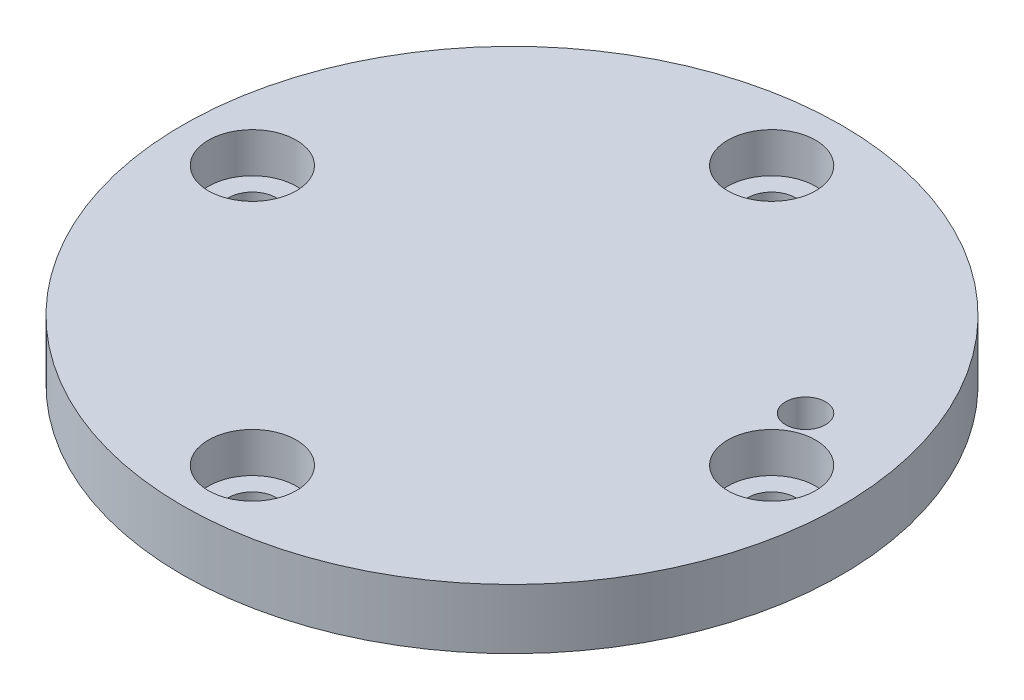
ISO-10303-21;
HEADER;
FILE_DESCRIPTION(('STEP AP214'),'2;1');
FILE_NAME('part.step','',(''),(''),'','','');
FILE_SCHEMA(('AUTOMOTIVE_DESIGN { 1 0 10303 214 1 1 1 1 }'));
ENDSEC;
DATA;
#1=APPLICATION_CONTEXT('core data for automotive mechanical design processes');
#2=APPLICATION_PROTOCOL_DEFINITION('international standard','automotive_design',2000,#1);
#3=PRODUCT_CONTEXT('',#1,'mechanical');
#4=PRODUCT('Part','Part','',(#3));
#5=PRODUCT_RELATED_PRODUCT_CATEGORY('part','',(#4));
#6=PRODUCT_DEFINITION_FORMATION('','',#4);
#7=PRODUCT_DEFINITION_CONTEXT('part definition',#1,'design');
#8=PRODUCT_DEFINITION('design','',#6,#7);
#9=PRODUCT_DEFINITION_SHAPE('','',#8);
#10=(LENGTH_UNIT() NAMED_UNIT(*) SI_UNIT(.MILLI.,.METRE.));
#11=(NAMED_UNIT(*) PLANE_ANGLE_UNIT() SI_UNIT($,.RADIAN.));
#12=(NAMED_UNIT(*) SI_UNIT($,.STERADIAN.) SOLID_ANGLE_UNIT());
#13=UNCERTAINTY_MEASURE_WITH_UNIT(LENGTH_MEASURE(1.E-05),#10,'distance_accuracy_value','');
#14=(GEOMETRIC_REPRESENTATION_CONTEXT(3) GLOBAL_UNCERTAINTY_ASSIGNED_CONTEXT((#13)) GLOBAL_UNIT_ASSIGNED_CONTEXT((#10,
#11,#12)) REPRESENTATION_CONTEXT('',''));
#15=CARTESIAN_POINT('',(0.,0.,0.));
#16=DIRECTION('',(0.,0.,1.));
#17=DIRECTION('',(1.,0.,0.));
#18=AXIS2_PLACEMENT_3D('',#15,#16,#17);
#19=CARTESIAN_POINT('',(0.,3.,0.));
#20=DIRECTION('',(0.,-1.,0.));
#21=DIRECTION('',(0.,0.,-1.));
#22=AXIS2_PLACEMENT_3D('',#19,#20,#21);
#23=CYLINDRICAL_SURFACE('',#22,16.5);
#24=CARTESIAN_POINT('',(0.,3.,0.));
#25=DIRECTION('',(0.,1.,0.));
#26=DIRECTION('',(0.,0.,1.));
#27=AXIS2_PLACEMENT_3D('',#24,#25,#26);
#28=CIRCLE('',#27,16.5);
#29=CARTESIAN_POINT('',(0.,3.,16.5));
#30=VERTEX_POINT('',#29);
#31=EDGE_CURVE('E10',#30,#30,#28,.T.);
#32=ORIENTED_EDGE('',*,*,#31,.F.);
#33=EDGE_LOOP('',(#32));
#34=FACE_BOUND('',#33,.T.);
#35=CARTESIAN_POINT('',(0.,0.,0.));
#36=DIRECTION('',(0.,1.,0.));
#37=DIRECTION('',(0.,0.,1.));
#38=AXIS2_PLACEMENT_3D('',#35,#36,#37);
#39=CIRCLE('',#38,16.5);
#40=CARTESIAN_POINT('',(0.,0.,16.5));
#41=VERTEX_POINT('',#40);
#42=EDGE_CURVE('E40',#41,#41,#39,.T.);
#43=ORIENTED_EDGE('',*,*,#42,.T.);
#44=EDGE_LOOP('',(#43));
#45=FACE_BOUND('',#44,.T.);
#46=ADVANCED_FACE('F37',(#34,#45),#23,.T.);
#47=CARTESIAN_POINT('',(0.,3.,0.));
#48=DIRECTION('',(0.,1.,0.));
#49=DIRECTION('',(0.,0.,1.));
#50=AXIS2_PLACEMENT_3D('',#47,#48,#49);
#51=PLANE('',#50);
#52=CARTESIAN_POINT('',(11.5911099154688,3.,-3.10582854123018));
#53=DIRECTION('',(0.,1.,0.));
#54=DIRECTION('',(0.,0.,1.));
#55=AXIS2_PLACEMENT_3D('',#52,#53,#54);
#56=CIRCLE('',#55,1.00000000000001);
#57=CARTESIAN_POINT('',(11.5911099154688,3.,-2.10582854123017));
#58=VERTEX_POINT('',#57);
#59=EDGE_CURVE('E100',#58,#58,#56,.T.);
#60=ORIENTED_EDGE('',*,*,#59,.F.);
#61=EDGE_LOOP('',(#60));
#62=FACE_BOUND('',#61,.T.);
#63=CARTESIAN_POINT('',(0.,3.,13.));
#64=DIRECTION('',(0.,1.,0.));
#65=DIRECTION('',(1.,0.,0.));
#66=AXIS2_PLACEMENT_3D('',#63,#64,#65);
#67=CIRCLE('',#66,2.19999999999999);
#68=CARTESIAN_POINT('',(2.20000000000004,3.,13.));
#69=VERTEX_POINT('',#68);
#70=EDGE_CURVE('E78',#69,#69,#67,.T.);
#71=ORIENTED_EDGE('',*,*,#70,.F.);
#72=EDGE_LOOP('',(#71));
#73=FACE_BOUND('',#72,.T.);
#74=CARTESIAN_POINT('',(13.,3.,0.));
#75=DIRECTION('',(0.,1.,0.));
#76=DIRECTION('',(0.,0.,-1.));
#77=AXIS2_PLACEMENT_3D('',#74,#75,#76);
#78=CIRCLE('',#77,2.19999999999999);
#79=CARTESIAN_POINT('',(13.,3.,-2.19999999999999));
#80=VERTEX_POINT('',#79);
#81=EDGE_CURVE('E64',#80,#80,#78,.T.);
#82=ORIENTED_EDGE('',*,*,#81,.F.);
#83=EDGE_LOOP('',(#82));
#84=FACE_BOUND('',#83,.T.);
#85=CARTESIAN_POINT('',(-1.36167772214882E-13,3.,-13.));
#86=DIRECTION('',(0.,1.,0.));
#87=DIRECTION('',(-1.,0.,0.));
#88=AXIS2_PLACEMENT_3D('',#85,#86,#87);
#89=CIRCLE('',#88,2.19999999999999);
#90=CARTESIAN_POINT('',(-2.20000000000013,3.,-13.));
#91=VERTEX_POINT('',#90);
#92=EDGE_CURVE('E71',#91,#91,#89,.T.);
#93=ORIENTED_EDGE('',*,*,#92,.F.);
#94=EDGE_LOOP('',(#93));
#95=FACE_BOUND('',#94,.T.);
#96=CARTESIAN_POINT('',(-13.,3.,0.));
#97=DIRECTION('',(0.,1.,0.));
#98=DIRECTION('',(0.,0.,1.));
#99=AXIS2_PLACEMENT_3D('',#96,#97,#98);
#100=CIRCLE('',#99,2.19999999999999);
#101=CARTESIAN_POINT('',(-13.,3.,2.19999999999999));
#102=VERTEX_POINT('',#101);
#103=EDGE_CURVE('E57',#102,#102,#100,.T.);
#104=ORIENTED_EDGE('',*,*,#103,.F.);
#105=EDGE_LOOP('',(#104));
#106=FACE_BOUND('',#105,.T.);
#107=ORIENTED_EDGE('',*,*,#31,.T.);
#108=EDGE_LOOP('',(#107));
#109=FACE_BOUND('',#108,.T.);
#110=ADVANCED_FACE('F124',(#62,#73,#84,#95,#106,#109),#51,.T.);
#111=CARTESIAN_POINT('',(0.,0.,0.));
#112=DIRECTION('',(0.,1.,0.));
#113=DIRECTION('',(0.,0.,1.));
#114=AXIS2_PLACEMENT_3D('',#111,#112,#113);
#115=PLANE('',#114);
#116=CARTESIAN_POINT('',(11.5911099154688,0.,-3.10582854123018));
#117=DIRECTION('',(0.,1.,0.));
#118=DIRECTION('',(0.,0.,1.));
#119=AXIS2_PLACEMENT_3D('',#116,#117,#118);
#120=CIRCLE('',#119,1.00000000000001);
#121=CARTESIAN_POINT('',(11.5911099154688,0.,-2.10582854123017));
#122=VERTEX_POINT('',#121);
#123=EDGE_CURVE('E105',#122,#122,#120,.T.);
#124=ORIENTED_EDGE('',*,*,#123,.T.);
#125=EDGE_LOOP('',(#124));
#126=FACE_BOUND('',#125,.T.);
#127=CARTESIAN_POINT('',(6.,0.,0.));
#128=DIRECTION('',(0.,-1.,0.));
#129=DIRECTION('',(0.,0.,-1.));
#130=AXIS2_PLACEMENT_3D('',#127,#128,#129);
#131=CIRCLE('',#130,0.500000000000001);
#132=CARTESIAN_POINT('',(6.,0.,-0.500000000000001));
#133=VERTEX_POINT('',#132);
#134=EDGE_CURVE('E97',#133,#133,#131,.T.);
#135=ORIENTED_EDGE('',*,*,#134,.F.);
#136=EDGE_LOOP('',(#135));
#137=FACE_BOUND('',#136,.T.);
#138=CARTESIAN_POINT('',(0.,0.,13.));
#139=DIRECTION('',(0.,1.,0.));
#140=DIRECTION('',(1.,0.,0.));
#141=AXIS2_PLACEMENT_3D('',#138,#139,#140);
#142=CIRCLE('',#141,1.2);
#143=CARTESIAN_POINT('',(1.20000000000005,0.,13.));
#144=VERTEX_POINT('',#143);
#145=EDGE_CURVE('E92',#144,#144,#142,.T.);
#146=ORIENTED_EDGE('',*,*,#145,.T.);
#147=EDGE_LOOP('',(#146));
#148=FACE_BOUND('',#147,.T.);
#149=CARTESIAN_POINT('',(13.,0.,0.));
#150=DIRECTION('',(0.,1.,0.));
#151=DIRECTION('',(0.,0.,-1.));
#152=AXIS2_PLACEMENT_3D('',#149,#150,#151);
#153=CIRCLE('',#152,1.2);
#154=CARTESIAN_POINT('',(13.,0.,-1.2));
#155=VERTEX_POINT('',#154);
#156=EDGE_CURVE('E82',#155,#155,#153,.T.);
#157=ORIENTED_EDGE('',*,*,#156,.T.);
#158=EDGE_LOOP('',(#157));
#159=FACE_BOUND('',#158,.T.);
#160=CARTESIAN_POINT('',(-1.36167772214882E-13,0.,-13.));
#161=DIRECTION('',(0.,1.,0.));
#162=DIRECTION('',(-1.,0.,0.));
#163=AXIS2_PLACEMENT_3D('',#160,#161,#162);
#164=CIRCLE('',#163,1.2);
#165=CARTESIAN_POINT('',(-1.20000000000014,0.,-13.));
#166=VERTEX_POINT('',#165);
#167=EDGE_CURVE('E68',#166,#166,#164,.T.);
#168=ORIENTED_EDGE('',*,*,#167,.T.);
#169=EDGE_LOOP('',(#168));
#170=FACE_BOUND('',#169,.T.);
#171=CARTESIAN_POINT('',(-13.,0.,0.));
#172=DIRECTION('',(0.,1.,0.));
#173=DIRECTION('',(0.,0.,1.));
#174=AXIS2_PLACEMENT_3D('',#171,#172,#173);
#175=CIRCLE('',#174,1.2);
#176=CARTESIAN_POINT('',(-13.,0.,1.2));
#177=VERTEX_POINT('',#176);
#178=EDGE_CURVE('E47',#177,#177,#175,.T.);
#179=ORIENTED_EDGE('',*,*,#178,.T.);
#180=EDGE_LOOP('',(#179));
#181=FACE_BOUND('',#180,.T.);
#182=ORIENTED_EDGE('',*,*,#42,.F.);
#183=EDGE_LOOP('',(#182));
#184=FACE_BOUND('',#183,.T.);
#185=ADVANCED_FACE('F109',(#126,#137,#148,#159,#170,#181,#184),#115,.F.);
#186=CARTESIAN_POINT('',(-13.,3.,0.));
#187=DIRECTION('',(0.,1.,0.));
#188=DIRECTION('',(0.,0.,1.));
#189=AXIS2_PLACEMENT_3D('',#186,#187,#188);
#190=CYLINDRICAL_SURFACE('',#189,1.20000000000001);
#191=ORIENTED_EDGE('',*,*,#178,.F.);
#192=EDGE_LOOP('',(#191));
#193=FACE_BOUND('',#192,.T.);
#194=CARTESIAN_POINT('',(-13.,0.999999999999998,0.));
#195=DIRECTION('',(0.,1.,0.));
#196=DIRECTION('',(0.,0.,1.));
#197=AXIS2_PLACEMENT_3D('',#194,#195,#196);
#198=CIRCLE('',#197,1.20000000000001);
#199=CARTESIAN_POINT('',(-13.,0.999999999999998,1.20000000000001));
#200=VERTEX_POINT('',#199);
#201=EDGE_CURVE('E51',#200,#200,#198,.T.);
#202=ORIENTED_EDGE('',*,*,#201,.T.);
#203=EDGE_LOOP('',(#202));
#204=FACE_BOUND('',#203,.T.);
#205=ADVANCED_FACE('F136',(#193,#204),#190,.F.);
#206=CARTESIAN_POINT('',(-11.8,0.999999999999998,0.));
#207=DIRECTION('',(0.,-1.,0.));
#208=DIRECTION('',(0.,0.,-1.));
#209=AXIS2_PLACEMENT_3D('',#206,#207,#208);
#210=PLANE('',#209);
#211=ORIENTED_EDGE('',*,*,#201,.F.);
#212=EDGE_LOOP('',(#211));
#213=FACE_BOUND('',#212,.T.);
#214=CARTESIAN_POINT('',(-13.,0.999999999999998,0.));
#215=DIRECTION('',(0.,1.,0.));
#216=DIRECTION('',(0.,0.,1.));
#217=AXIS2_PLACEMENT_3D('',#214,#215,#216);
#218=CIRCLE('',#217,2.19999999999999);
#219=CARTESIAN_POINT('',(-13.,0.999999999999998,2.19999999999999));
#220=VERTEX_POINT('',#219);
#221=EDGE_CURVE('E54',#220,#220,#218,.T.);
#222=ORIENTED_EDGE('',*,*,#221,.T.);
#223=EDGE_LOOP('',(#222));
#224=FACE_BOUND('',#223,.T.);
#225=ADVANCED_FACE('F141',(#213,#224),#210,.F.);
#226=CARTESIAN_POINT('',(-13.,3.,0.));
#227=DIRECTION('',(0.,1.,0.));
#228=DIRECTION('',(0.,0.,1.));
#229=AXIS2_PLACEMENT_3D('',#226,#227,#228);
#230=CYLINDRICAL_SURFACE('',#229,2.19999999999999);
#231=ORIENTED_EDGE('',*,*,#221,.F.);
#232=EDGE_LOOP('',(#231));
#233=FACE_BOUND('',#232,.T.);
#234=ORIENTED_EDGE('',*,*,#103,.T.);
#235=EDGE_LOOP('',(#234));
#236=FACE_BOUND('',#235,.T.);
#237=ADVANCED_FACE('F147',(#233,#236),#230,.F.);
#238=CARTESIAN_POINT('',(-1.36167772214882E-13,3.,-13.));
#239=DIRECTION('',(0.,1.,0.));
#240=DIRECTION('',(-1.,0.,0.));
#241=AXIS2_PLACEMENT_3D('',#238,#239,#240);
#242=CYLINDRICAL_SURFACE('',#241,1.20000000000001);
#243=ORIENTED_EDGE('',*,*,#167,.F.);
#244=EDGE_LOOP('',(#243));
#245=FACE_BOUND('',#244,.T.);
#246=CARTESIAN_POINT('',(-1.36167772214882E-13,0.999999999999998,-13.));
#247=DIRECTION('',(0.,1.,0.));
#248=DIRECTION('',(-1.,0.,0.));
#249=AXIS2_PLACEMENT_3D('',#246,#247,#248);
#250=CIRCLE('',#249,1.20000000000001);
#251=CARTESIAN_POINT('',(-1.20000000000015,0.999999999999998,-13.));
#252=VERTEX_POINT('',#251);
#253=EDGE_CURVE('E61',#252,#252,#250,.T.);
#254=ORIENTED_EDGE('',*,*,#253,.T.);
#255=EDGE_LOOP('',(#254));
#256=FACE_BOUND('',#255,.T.);
#257=ADVANCED_FACE('F151',(#245,#256),#242,.F.);
#258=CARTESIAN_POINT('',(-1.23598439395047E-13,0.999999999999998,-11.8));
#259=DIRECTION('',(0.,-1.,0.));
#260=DIRECTION('',(1.,0.,0.));
#261=AXIS2_PLACEMENT_3D('',#258,#259,#260);
#262=PLANE('',#261);
#263=ORIENTED_EDGE('',*,*,#253,.F.);
#264=EDGE_LOOP('',(#263));
#265=FACE_BOUND('',#264,.T.);
#266=CARTESIAN_POINT('',(-1.36167772214882E-13,0.999999999999998,-13.));
#267=DIRECTION('',(0.,1.,0.));
#268=DIRECTION('',(-1.,0.,0.));
#269=AXIS2_PLACEMENT_3D('',#266,#267,#268);
#270=CIRCLE('',#269,2.19999999999999);
#271=CARTESIAN_POINT('',(-2.20000000000013,0.999999999999998,-13.));
#272=VERTEX_POINT('',#271);
#273=EDGE_CURVE('E65',#272,#272,#270,.T.);
#274=ORIENTED_EDGE('',*,*,#273,.T.);
#275=EDGE_LOOP('',(#274));
#276=FACE_BOUND('',#275,.T.);
#277=ADVANCED_FACE('F155',(#265,#276),#262,.F.);
#278=CARTESIAN_POINT('',(-1.36167772214882E-13,3.,-13.));
#279=DIRECTION('',(0.,1.,0.));
#280=DIRECTION('',(-1.,0.,0.));
#281=AXIS2_PLACEMENT_3D('',#278,#279,#280);
#282=CYLINDRICAL_SURFACE('',#281,2.19999999999999);
#283=ORIENTED_EDGE('',*,*,#273,.F.);
#284=EDGE_LOOP('',(#283));
#285=FACE_BOUND('',#284,.T.);
#286=ORIENTED_EDGE('',*,*,#92,.T.);
#287=EDGE_LOOP('',(#286));
#288=FACE_BOUND('',#287,.T.);
#289=ADVANCED_FACE('F159',(#285,#288),#282,.F.);
#290=CARTESIAN_POINT('',(13.,3.,0.));
#291=DIRECTION('',(0.,1.,0.));
#292=DIRECTION('',(0.,0.,-1.));
#293=AXIS2_PLACEMENT_3D('',#290,#291,#292);
#294=CYLINDRICAL_SURFACE('',#293,1.20000000000001);
#295=ORIENTED_EDGE('',*,*,#156,.F.);
#296=EDGE_LOOP('',(#295));
#297=FACE_BOUND('',#296,.T.);
#298=CARTESIAN_POINT('',(13.,0.999999999999998,0.));
#299=DIRECTION('',(0.,1.,0.));
#300=DIRECTION('',(0.,0.,-1.));
#301=AXIS2_PLACEMENT_3D('',#298,#299,#300);
#302=CIRCLE('',#301,1.20000000000001);
#303=CARTESIAN_POINT('',(13.,0.999999999999998,-1.20000000000001));
#304=VERTEX_POINT('',#303);
#305=EDGE_CURVE('E75',#304,#304,#302,.T.);
#306=ORIENTED_EDGE('',*,*,#305,.T.);
#307=EDGE_LOOP('',(#306));
#308=FACE_BOUND('',#307,.T.);
#309=ADVANCED_FACE('F163',(#297,#308),#294,.F.);
#310=CARTESIAN_POINT('',(11.8,0.999999999999998,0.));
#311=DIRECTION('',(0.,-1.,0.));
#312=DIRECTION('',(0.,0.,1.));
#313=AXIS2_PLACEMENT_3D('',#310,#311,#312);
#314=PLANE('',#313);
#315=ORIENTED_EDGE('',*,*,#305,.F.);
#316=EDGE_LOOP('',(#315));
#317=FACE_BOUND('',#316,.T.);
#318=CARTESIAN_POINT('',(13.,0.999999999999998,0.));
#319=DIRECTION('',(0.,1.,0.));
#320=DIRECTION('',(0.,0.,-1.));
#321=AXIS2_PLACEMENT_3D('',#318,#319,#320);
#322=CIRCLE('',#321,2.19999999999999);
#323=CARTESIAN_POINT('',(13.,0.999999999999998,-2.19999999999999));
#324=VERTEX_POINT('',#323);
#325=EDGE_CURVE('E79',#324,#324,#322,.T.);
#326=ORIENTED_EDGE('',*,*,#325,.T.);
#327=EDGE_LOOP('',(#326));
#328=FACE_BOUND('',#327,.T.);
#329=ADVANCED_FACE('F167',(#317,#328),#314,.F.);
#330=CARTESIAN_POINT('',(13.,3.,0.));
#331=DIRECTION('',(0.,1.,0.));
#332=DIRECTION('',(0.,0.,-1.));
#333=AXIS2_PLACEMENT_3D('',#330,#331,#332);
#334=CYLINDRICAL_SURFACE('',#333,2.19999999999999);
#335=ORIENTED_EDGE('',*,*,#325,.F.);
#336=EDGE_LOOP('',(#335));
#337=FACE_BOUND('',#336,.T.);
#338=ORIENTED_EDGE('',*,*,#81,.T.);
#339=EDGE_LOOP('',(#338));
#340=FACE_BOUND('',#339,.T.);
#341=ADVANCED_FACE('F171',(#337,#340),#334,.F.);
#342=CARTESIAN_POINT('',(0.,3.,13.));
#343=DIRECTION('',(0.,1.,0.));
#344=DIRECTION('',(1.,0.,0.));
#345=AXIS2_PLACEMENT_3D('',#342,#343,#344);
#346=CYLINDRICAL_SURFACE('',#345,1.20000000000001);
#347=ORIENTED_EDGE('',*,*,#145,.F.);
#348=EDGE_LOOP('',(#347));
#349=FACE_BOUND('',#348,.T.);
#350=CARTESIAN_POINT('',(0.,0.999999999999998,13.));
#351=DIRECTION('',(0.,1.,0.));
#352=DIRECTION('',(1.,0.,0.));
#353=AXIS2_PLACEMENT_3D('',#350,#351,#352);
#354=CIRCLE('',#353,1.20000000000001);
#355=CARTESIAN_POINT('',(1.20000000000006,0.999999999999998,13.));
#356=VERTEX_POINT('',#355);
#357=EDGE_CURVE('E60',#356,#356,#354,.T.);
#358=ORIENTED_EDGE('',*,*,#357,.T.);
#359=EDGE_LOOP('',(#358));
#360=FACE_BOUND('',#359,.T.);
#361=ADVANCED_FACE('F175',(#349,#360),#346,.F.);
#362=CARTESIAN_POINT('',(0.,0.999999999999998,11.8));
#363=DIRECTION('',(0.,-1.,0.));
#364=DIRECTION('',(-1.,0.,0.));
#365=AXIS2_PLACEMENT_3D('',#362,#363,#364);
#366=PLANE('',#365);
#367=ORIENTED_EDGE('',*,*,#357,.F.);
#368=EDGE_LOOP('',(#367));
#369=FACE_BOUND('',#368,.T.);
#370=CARTESIAN_POINT('',(0.,0.999999999999998,13.));
#371=DIRECTION('',(0.,1.,0.));
#372=DIRECTION('',(1.,0.,0.));
#373=AXIS2_PLACEMENT_3D('',#370,#371,#372);
#374=CIRCLE('',#373,2.19999999999999);
#375=CARTESIAN_POINT('',(2.20000000000004,0.999999999999998,13.));
#376=VERTEX_POINT('',#375);
#377=EDGE_CURVE('E89',#376,#376,#374,.T.);
#378=ORIENTED_EDGE('',*,*,#377,.T.);
#379=EDGE_LOOP('',(#378));
#380=FACE_BOUND('',#379,.T.);
#381=ADVANCED_FACE('F179',(#369,#380),#366,.F.);
#382=CARTESIAN_POINT('',(0.,3.,13.));
#383=DIRECTION('',(0.,1.,0.));
#384=DIRECTION('',(1.,0.,0.));
#385=AXIS2_PLACEMENT_3D('',#382,#383,#384);
#386=CYLINDRICAL_SURFACE('',#385,2.19999999999999);
#387=ORIENTED_EDGE('',*,*,#377,.F.);
#388=EDGE_LOOP('',(#387));
#389=FACE_BOUND('',#388,.T.);
#390=ORIENTED_EDGE('',*,*,#70,.T.);
#391=EDGE_LOOP('',(#390));
#392=FACE_BOUND('',#391,.T.);
#393=ADVANCED_FACE('F183',(#389,#392),#386,.F.);
#394=CARTESIAN_POINT('',(6.,1.5,0.));
#395=DIRECTION('',(0.,-1.,0.));
#396=DIRECTION('',(0.,0.,-1.));
#397=AXIS2_PLACEMENT_3D('',#394,#395,#396);
#398=CYLINDRICAL_SURFACE('',#397,0.500000000000001);
#399=CARTESIAN_POINT('',(6.,1.5,0.));
#400=DIRECTION('',(0.,-1.,0.));
#401=DIRECTION('',(0.,0.,-1.));
#402=AXIS2_PLACEMENT_3D('',#399,#400,#401);
#403=CIRCLE('',#402,0.500000000000001);
#404=CARTESIAN_POINT('',(6.,1.5,-0.500000000000001));
#405=VERTEX_POINT('',#404);
#406=EDGE_CURVE('E74',#405,#405,#403,.T.);
#407=ORIENTED_EDGE('',*,*,#406,.F.);
#408=EDGE_LOOP('',(#407));
#409=FACE_BOUND('',#408,.T.);
#410=ORIENTED_EDGE('',*,*,#134,.T.);
#411=EDGE_LOOP('',(#410));
#412=FACE_BOUND('',#411,.T.);
#413=ADVANCED_FACE('F120',(#409,#412),#398,.F.);
#414=CARTESIAN_POINT('',(6.,1.5,0.));
#415=DIRECTION('',(0.,-1.,0.));
#416=DIRECTION('',(0.,0.,-1.));
#417=AXIS2_PLACEMENT_3D('',#414,#415,#416);
#418=PLANE('',#417);
#419=ORIENTED_EDGE('',*,*,#406,.T.);
#420=EDGE_LOOP('',(#419));
#421=FACE_BOUND('',#420,.T.);
#422=ADVANCED_FACE('F114',(#421),#418,.T.);
#423=CARTESIAN_POINT('',(11.5911099154688,0.,-3.10582854123018));
#424=DIRECTION('',(0.,1.,0.));
#425=DIRECTION('',(0.,0.,1.));
#426=AXIS2_PLACEMENT_3D('',#423,#424,#425);
#427=CYLINDRICAL_SURFACE('',#426,1.00000000000001);
#428=ORIENTED_EDGE('',*,*,#59,.T.);
#429=EDGE_LOOP('',(#428));
#430=FACE_BOUND('',#429,.T.);
#431=ORIENTED_EDGE('',*,*,#123,.F.);
#432=EDGE_LOOP('',(#431));
#433=FACE_BOUND('',#432,.T.);
#434=ADVANCED_FACE('F112',(#430,#433),#427,.F.);
#435=CLOSED_SHELL('',(#46,#110,#185,#205,#225,#237,#257,#277,#289,#309,#329,#341,#361,#381,#393,
#413,#422,#434));
#436=MANIFOLD_SOLID_BREP('B2',#435);
#437=ADVANCED_BREP_SHAPE_REPRESENTATION('',(#18,#436),#14);
#438=SHAPE_DEFINITION_REPRESENTATION(#9,#437);
ENDSEC;
END-ISO-10303-21;
